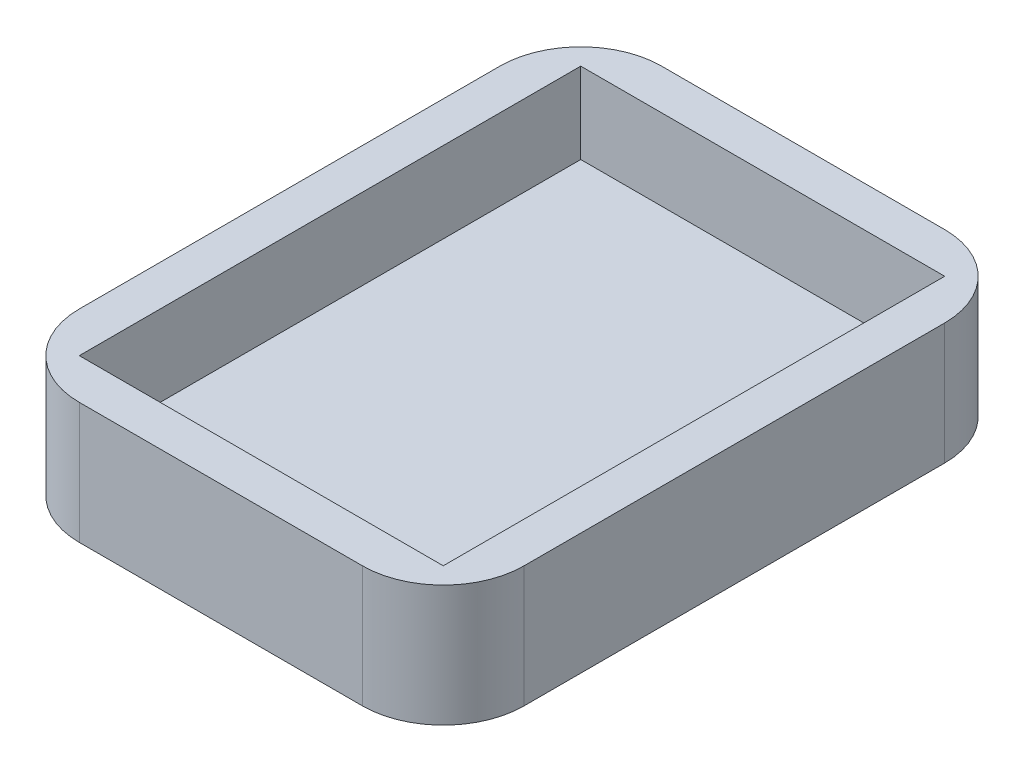
ISO-10303-21;
HEADER;
FILE_DESCRIPTION(('STEP AP214'),'2;1');
FILE_NAME('part.step','',(''),(''),'','','');
FILE_SCHEMA(('AUTOMOTIVE_DESIGN { 1 0 10303 214 1 1 1 1 }'));
ENDSEC;
DATA;
#1=APPLICATION_CONTEXT('core data for automotive mechanical design processes');
#2=APPLICATION_PROTOCOL_DEFINITION('international standard','automotive_design',2000,#1);
#3=PRODUCT_CONTEXT('',#1,'mechanical');
#4=PRODUCT('Part','Part','',(#3));
#5=PRODUCT_RELATED_PRODUCT_CATEGORY('part','',(#4));
#6=PRODUCT_DEFINITION_FORMATION('','',#4);
#7=PRODUCT_DEFINITION_CONTEXT('part definition',#1,'design');
#8=PRODUCT_DEFINITION('design','',#6,#7);
#9=PRODUCT_DEFINITION_SHAPE('','',#8);
#10=(LENGTH_UNIT() NAMED_UNIT(*) SI_UNIT(.MILLI.,.METRE.));
#11=(NAMED_UNIT(*) PLANE_ANGLE_UNIT() SI_UNIT($,.RADIAN.));
#12=(NAMED_UNIT(*) SI_UNIT($,.STERADIAN.) SOLID_ANGLE_UNIT());
#13=UNCERTAINTY_MEASURE_WITH_UNIT(LENGTH_MEASURE(1.E-05),#10,'distance_accuracy_value','');
#14=(GEOMETRIC_REPRESENTATION_CONTEXT(3) GLOBAL_UNCERTAINTY_ASSIGNED_CONTEXT((#13)) GLOBAL_UNIT_ASSIGNED_CONTEXT((#10,
#11,#12)) REPRESENTATION_CONTEXT('',''));
#15=CARTESIAN_POINT('',(0.,0.,0.));
#16=DIRECTION('',(0.,0.,1.));
#17=DIRECTION('',(1.,0.,0.));
#18=AXIS2_PLACEMENT_3D('',#15,#16,#17);
#19=CARTESIAN_POINT('',(0.,5.,0.));
#20=DIRECTION('',(0.,-1.,0.));
#21=DIRECTION('',(0.,0.,-1.));
#22=AXIS2_PLACEMENT_3D('',#19,#20,#21);
#23=PLANE('',#22);
#24=DIRECTION('',(0.,0.,1.));
#25=VECTOR('',#24,1.);
#26=CARTESIAN_POINT('',(0.,5.,0.));
#27=LINE('',#26,#25);
#28=CARTESIAN_POINT('',(0.,5.,-62.));
#29=VERTEX_POINT('',#28);
#30=CARTESIAN_POINT('',(0.,5.,0.));
#31=VERTEX_POINT('',#30);
#32=EDGE_CURVE('E135',#29,#31,#27,.T.);
#33=ORIENTED_EDGE('',*,*,#32,.T.);
#34=DIRECTION('',(1.,0.,0.));
#35=VECTOR('',#34,1.);
#36=CARTESIAN_POINT('',(0.,5.,0.));
#37=LINE('',#36,#35);
#38=CARTESIAN_POINT('',(45.,5.,0.));
#39=VERTEX_POINT('',#38);
#40=EDGE_CURVE('E185',#31,#39,#37,.T.);
#41=ORIENTED_EDGE('',*,*,#40,.T.);
#42=DIRECTION('',(0.,0.,-1.));
#43=VECTOR('',#42,1.);
#44=CARTESIAN_POINT('',(45.,5.,0.));
#45=LINE('',#44,#43);
#46=CARTESIAN_POINT('',(45.,5.,-62.));
#47=VERTEX_POINT('',#46);
#48=EDGE_CURVE('E188',#39,#47,#45,.T.);
#49=ORIENTED_EDGE('',*,*,#48,.T.);
#50=DIRECTION('',(-1.,0.,0.));
#51=VECTOR('',#50,1.);
#52=CARTESIAN_POINT('',(0.,5.,-62.));
#53=LINE('',#52,#51);
#54=EDGE_CURVE('E191',#47,#29,#53,.T.);
#55=ORIENTED_EDGE('',*,*,#54,.T.);
#56=EDGE_LOOP('',(#33,#41,#49,#55));
#57=FACE_BOUND('',#56,.T.);
#58=ADVANCED_FACE('F39',(#57),#23,.F.);
#59=CARTESIAN_POINT('',(45.,0.,-62.));
#60=DIRECTION('',(0.,0.,-1.));
#61=DIRECTION('',(-1.,0.,0.));
#62=AXIS2_PLACEMENT_3D('',#59,#60,#61);
#63=PLANE('',#62);
#64=DIRECTION('',(0.,1.,0.));
#65=VECTOR('',#64,1.);
#66=CARTESIAN_POINT('',(0.,0.,-62.));
#67=LINE('',#66,#65);
#68=CARTESIAN_POINT('',(0.,15.,-62.));
#69=VERTEX_POINT('',#68);
#70=EDGE_CURVE('E128',#29,#69,#67,.T.);
#71=ORIENTED_EDGE('',*,*,#70,.F.);
#72=ORIENTED_EDGE('',*,*,#54,.F.);
#73=DIRECTION('',(0.,1.,0.));
#74=VECTOR('',#73,1.);
#75=CARTESIAN_POINT('',(45.,0.,-62.));
#76=LINE('',#75,#74);
#77=CARTESIAN_POINT('',(45.,15.,-62.));
#78=VERTEX_POINT('',#77);
#79=EDGE_CURVE('E145',#47,#78,#76,.T.);
#80=ORIENTED_EDGE('',*,*,#79,.T.);
#81=DIRECTION('',(-1.,0.,0.));
#82=VECTOR('',#81,1.);
#83=CARTESIAN_POINT('',(45.,15.,-62.));
#84=LINE('',#83,#82);
#85=EDGE_CURVE('E142',#78,#69,#84,.T.);
#86=ORIENTED_EDGE('',*,*,#85,.T.);
#87=EDGE_LOOP('',(#71,#72,#80,#86));
#88=FACE_BOUND('',#87,.T.);
#89=ADVANCED_FACE('F143',(#88),#63,.F.);
#90=CARTESIAN_POINT('',(45.,0.,0.));
#91=DIRECTION('',(1.,0.,0.));
#92=DIRECTION('',(0.,0.,-1.));
#93=AXIS2_PLACEMENT_3D('',#90,#91,#92);
#94=PLANE('',#93);
#95=ORIENTED_EDGE('',*,*,#79,.F.);
#96=ORIENTED_EDGE('',*,*,#48,.F.);
#97=DIRECTION('',(0.,1.,0.));
#98=VECTOR('',#97,1.);
#99=CARTESIAN_POINT('',(45.,0.,0.));
#100=LINE('',#99,#98);
#101=CARTESIAN_POINT('',(45.,15.,0.));
#102=VERTEX_POINT('',#101);
#103=EDGE_CURVE('E171',#39,#102,#100,.T.);
#104=ORIENTED_EDGE('',*,*,#103,.T.);
#105=DIRECTION('',(0.,0.,-1.));
#106=VECTOR('',#105,1.);
#107=CARTESIAN_POINT('',(45.,15.,0.));
#108=LINE('',#107,#106);
#109=EDGE_CURVE('E154',#102,#78,#108,.T.);
#110=ORIENTED_EDGE('',*,*,#109,.T.);
#111=EDGE_LOOP('',(#95,#96,#104,#110));
#112=FACE_BOUND('',#111,.T.);
#113=ADVANCED_FACE('F266',(#112),#94,.F.);
#114=CARTESIAN_POINT('',(0.,0.,0.));
#115=DIRECTION('',(0.,0.,1.));
#116=DIRECTION('',(1.,0.,0.));
#117=AXIS2_PLACEMENT_3D('',#114,#115,#116);
#118=PLANE('',#117);
#119=ORIENTED_EDGE('',*,*,#103,.F.);
#120=ORIENTED_EDGE('',*,*,#40,.F.);
#121=DIRECTION('',(0.,1.,0.));
#122=VECTOR('',#121,1.);
#123=CARTESIAN_POINT('',(0.,0.,0.));
#124=LINE('',#123,#122);
#125=CARTESIAN_POINT('',(0.,15.,0.));
#126=VERTEX_POINT('',#125);
#127=EDGE_CURVE('E138',#31,#126,#124,.T.);
#128=ORIENTED_EDGE('',*,*,#127,.T.);
#129=DIRECTION('',(1.,0.,0.));
#130=VECTOR('',#129,1.);
#131=CARTESIAN_POINT('',(0.,15.,0.));
#132=LINE('',#131,#130);
#133=EDGE_CURVE('E152',#126,#102,#132,.T.);
#134=ORIENTED_EDGE('',*,*,#133,.T.);
#135=EDGE_LOOP('',(#119,#120,#128,#134));
#136=FACE_BOUND('',#135,.T.);
#137=ADVANCED_FACE('F336',(#136),#118,.F.);
#138=CARTESIAN_POINT('',(0.,0.,-62.));
#139=DIRECTION('',(-1.,0.,0.));
#140=DIRECTION('',(0.,0.,1.));
#141=AXIS2_PLACEMENT_3D('',#138,#139,#140);
#142=PLANE('',#141);
#143=ORIENTED_EDGE('',*,*,#127,.F.);
#144=ORIENTED_EDGE('',*,*,#32,.F.);
#145=ORIENTED_EDGE('',*,*,#70,.T.);
#146=DIRECTION('',(0.,0.,1.));
#147=VECTOR('',#146,1.);
#148=CARTESIAN_POINT('',(0.,15.,-62.));
#149=LINE('',#148,#147);
#150=EDGE_CURVE('E132',#69,#126,#149,.T.);
#151=ORIENTED_EDGE('',*,*,#150,.T.);
#152=EDGE_LOOP('',(#143,#144,#145,#151));
#153=FACE_BOUND('',#152,.T.);
#154=ADVANCED_FACE('F130',(#153),#142,.F.);
#155=CARTESIAN_POINT('',(-5.00000000000001,0.,5.));
#156=DIRECTION('',(0.,0.,1.));
#157=DIRECTION('',(1.,0.,0.));
#158=AXIS2_PLACEMENT_3D('',#155,#156,#157);
#159=PLANE('',#158);
#160=DIRECTION('',(1.,0.,0.));
#161=VECTOR('',#160,1.);
#162=CARTESIAN_POINT('',(-5.00000000000001,0.,5.));
#163=LINE('',#162,#161);
#164=CARTESIAN_POINT('',(4.99999999999999,0.,5.));
#165=VERTEX_POINT('',#164);
#166=CARTESIAN_POINT('',(40.,0.,5.));
#167=VERTEX_POINT('',#166);
#168=EDGE_CURVE('E170',#165,#167,#163,.T.);
#169=ORIENTED_EDGE('',*,*,#168,.T.);
#170=DIRECTION('',(0.,1.,0.));
#171=VECTOR('',#170,1.);
#172=CARTESIAN_POINT('',(40.,0.,5.));
#173=LINE('',#172,#171);
#174=CARTESIAN_POINT('',(40.,15.,5.));
#175=VERTEX_POINT('',#174);
#176=EDGE_CURVE('E220',#167,#175,#173,.T.);
#177=ORIENTED_EDGE('',*,*,#176,.T.);
#178=DIRECTION('',(1.,0.,0.));
#179=VECTOR('',#178,1.);
#180=CARTESIAN_POINT('',(-5.00000000000001,15.,5.));
#181=LINE('',#180,#179);
#182=CARTESIAN_POINT('',(4.99999999999999,15.,5.));
#183=VERTEX_POINT('',#182);
#184=EDGE_CURVE('E158',#183,#175,#181,.T.);
#185=ORIENTED_EDGE('',*,*,#184,.F.);
#186=DIRECTION('',(0.,1.,0.));
#187=VECTOR('',#186,1.);
#188=CARTESIAN_POINT('',(4.99999999999999,0.,5.));
#189=LINE('',#188,#187);
#190=EDGE_CURVE('E218',#183,#165,#189,.F.);
#191=ORIENTED_EDGE('',*,*,#190,.T.);
#192=EDGE_LOOP('',(#169,#177,#185,#191));
#193=FACE_BOUND('',#192,.T.);
#194=ADVANCED_FACE('F234',(#193),#159,.T.);
#195=CARTESIAN_POINT('',(-5.00000000000001,0.,-67.));
#196=DIRECTION('',(-1.,0.,0.));
#197=DIRECTION('',(0.,0.,1.));
#198=AXIS2_PLACEMENT_3D('',#195,#196,#197);
#199=PLANE('',#198);
#200=DIRECTION('',(0.,0.,1.));
#201=VECTOR('',#200,1.);
#202=CARTESIAN_POINT('',(-5.00000000000001,15.,-67.));
#203=LINE('',#202,#201);
#204=CARTESIAN_POINT('',(-5.00000000000001,15.,-57.));
#205=VERTEX_POINT('',#204);
#206=CARTESIAN_POINT('',(-5.00000000000001,15.,-5.));
#207=VERTEX_POINT('',#206);
#208=EDGE_CURVE('E139',#205,#207,#203,.T.);
#209=ORIENTED_EDGE('',*,*,#208,.F.);
#210=DIRECTION('',(0.,1.,0.));
#211=VECTOR('',#210,1.);
#212=CARTESIAN_POINT('',(-5.00000000000001,0.,-57.));
#213=LINE('',#212,#211);
#214=CARTESIAN_POINT('',(-5.00000000000001,0.,-57.));
#215=VERTEX_POINT('',#214);
#216=EDGE_CURVE('E209',#205,#215,#213,.F.);
#217=ORIENTED_EDGE('',*,*,#216,.T.);
#218=DIRECTION('',(0.,0.,1.));
#219=VECTOR('',#218,1.);
#220=CARTESIAN_POINT('',(-5.00000000000001,0.,-67.));
#221=LINE('',#220,#219);
#222=CARTESIAN_POINT('',(-5.00000000000001,0.,-5.));
#223=VERTEX_POINT('',#222);
#224=EDGE_CURVE('E181',#215,#223,#221,.T.);
#225=ORIENTED_EDGE('',*,*,#224,.T.);
#226=DIRECTION('',(0.,1.,0.));
#227=VECTOR('',#226,1.);
#228=CARTESIAN_POINT('',(-5.00000000000001,0.,-5.));
#229=LINE('',#228,#227);
#230=EDGE_CURVE('E206',#223,#207,#229,.T.);
#231=ORIENTED_EDGE('',*,*,#230,.T.);
#232=EDGE_LOOP('',(#209,#217,#225,#231));
#233=FACE_BOUND('',#232,.T.);
#234=ADVANCED_FACE('F244',(#233),#199,.T.);
#235=CARTESIAN_POINT('',(50.,0.,-67.));
#236=DIRECTION('',(0.,0.,-1.));
#237=DIRECTION('',(-1.,0.,0.));
#238=AXIS2_PLACEMENT_3D('',#235,#236,#237);
#239=PLANE('',#238);
#240=DIRECTION('',(-1.,0.,0.));
#241=VECTOR('',#240,1.);
#242=CARTESIAN_POINT('',(50.,0.,-67.));
#243=LINE('',#242,#241);
#244=CARTESIAN_POINT('',(40.,0.,-67.));
#245=VERTEX_POINT('',#244);
#246=CARTESIAN_POINT('',(4.99999999999998,0.,-67.));
#247=VERTEX_POINT('',#246);
#248=EDGE_CURVE('E178',#245,#247,#243,.T.);
#249=ORIENTED_EDGE('',*,*,#248,.T.);
#250=DIRECTION('',(0.,1.,0.));
#251=VECTOR('',#250,1.);
#252=CARTESIAN_POINT('',(4.99999999999998,0.,-67.));
#253=LINE('',#252,#251);
#254=CARTESIAN_POINT('',(4.99999999999998,15.,-67.));
#255=VERTEX_POINT('',#254);
#256=EDGE_CURVE('E195',#247,#255,#253,.T.);
#257=ORIENTED_EDGE('',*,*,#256,.T.);
#258=DIRECTION('',(-1.,0.,0.));
#259=VECTOR('',#258,1.);
#260=CARTESIAN_POINT('',(50.,15.,-67.));
#261=LINE('',#260,#259);
#262=CARTESIAN_POINT('',(40.,15.,-67.));
#263=VERTEX_POINT('',#262);
#264=EDGE_CURVE('E164',#263,#255,#261,.T.);
#265=ORIENTED_EDGE('',*,*,#264,.F.);
#266=DIRECTION('',(0.,1.,0.));
#267=VECTOR('',#266,1.);
#268=CARTESIAN_POINT('',(40.,0.,-67.));
#269=LINE('',#268,#267);
#270=EDGE_CURVE('E193',#263,#245,#269,.F.);
#271=ORIENTED_EDGE('',*,*,#270,.T.);
#272=EDGE_LOOP('',(#249,#257,#265,#271));
#273=FACE_BOUND('',#272,.T.);
#274=ADVANCED_FACE('F251',(#273),#239,.T.);
#275=CARTESIAN_POINT('',(50.,0.,5.));
#276=DIRECTION('',(1.,0.,0.));
#277=DIRECTION('',(0.,0.,-1.));
#278=AXIS2_PLACEMENT_3D('',#275,#276,#277);
#279=PLANE('',#278);
#280=DIRECTION('',(0.,0.,-1.));
#281=VECTOR('',#280,1.);
#282=CARTESIAN_POINT('',(50.,15.,5.));
#283=LINE('',#282,#281);
#284=CARTESIAN_POINT('',(50.,15.,-5.));
#285=VERTEX_POINT('',#284);
#286=CARTESIAN_POINT('',(50.,15.,-57.));
#287=VERTEX_POINT('',#286);
#288=EDGE_CURVE('E161',#285,#287,#283,.T.);
#289=ORIENTED_EDGE('',*,*,#288,.F.);
#290=DIRECTION('',(0.,1.,0.));
#291=VECTOR('',#290,1.);
#292=CARTESIAN_POINT('',(50.,0.,-5.));
#293=LINE('',#292,#291);
#294=CARTESIAN_POINT('',(50.,0.,-5.));
#295=VERTEX_POINT('',#294);
#296=EDGE_CURVE('E11',#285,#295,#293,.F.);
#297=ORIENTED_EDGE('',*,*,#296,.T.);
#298=DIRECTION('',(0.,0.,-1.));
#299=VECTOR('',#298,1.);
#300=CARTESIAN_POINT('',(50.,0.,5.));
#301=LINE('',#300,#299);
#302=CARTESIAN_POINT('',(50.,0.,-57.));
#303=VERTEX_POINT('',#302);
#304=EDGE_CURVE('E176',#295,#303,#301,.T.);
#305=ORIENTED_EDGE('',*,*,#304,.T.);
#306=DIRECTION('',(0.,1.,0.));
#307=VECTOR('',#306,1.);
#308=CARTESIAN_POINT('',(50.,0.,-57.));
#309=LINE('',#308,#307);
#310=EDGE_CURVE('E47',#303,#287,#309,.T.);
#311=ORIENTED_EDGE('',*,*,#310,.T.);
#312=EDGE_LOOP('',(#289,#297,#305,#311));
#313=FACE_BOUND('',#312,.T.);
#314=ADVANCED_FACE('F224',(#313),#279,.T.);
#315=CARTESIAN_POINT('',(0.,15.,0.));
#316=DIRECTION('',(0.,1.,0.));
#317=DIRECTION('',(0.,0.,1.));
#318=AXIS2_PLACEMENT_3D('',#315,#316,#317);
#319=PLANE('',#318);
#320=ORIENTED_EDGE('',*,*,#264,.T.);
#321=CARTESIAN_POINT('',(4.99999999999998,15.,-57.));
#322=DIRECTION('',(0.,1.,0.));
#323=DIRECTION('',(0.,0.,1.));
#324=AXIS2_PLACEMENT_3D('',#321,#322,#323);
#325=CIRCLE('',#324,10.);
#326=EDGE_CURVE('E204',#255,#205,#325,.T.);
#327=ORIENTED_EDGE('',*,*,#326,.T.);
#328=ORIENTED_EDGE('',*,*,#208,.T.);
#329=CARTESIAN_POINT('',(4.99999999999999,15.,-5.));
#330=DIRECTION('',(0.,1.,0.));
#331=DIRECTION('',(0.,0.,1.));
#332=AXIS2_PLACEMENT_3D('',#329,#330,#331);
#333=CIRCLE('',#332,10.);
#334=EDGE_CURVE('E198',#207,#183,#333,.T.);
#335=ORIENTED_EDGE('',*,*,#334,.T.);
#336=ORIENTED_EDGE('',*,*,#184,.T.);
#337=CARTESIAN_POINT('',(40.,15.,-5.));
#338=DIRECTION('',(0.,1.,0.));
#339=DIRECTION('',(0.,0.,1.));
#340=AXIS2_PLACEMENT_3D('',#337,#338,#339);
#341=CIRCLE('',#340,10.);
#342=EDGE_CURVE('E202',#175,#285,#341,.T.);
#343=ORIENTED_EDGE('',*,*,#342,.T.);
#344=ORIENTED_EDGE('',*,*,#288,.T.);
#345=CARTESIAN_POINT('',(40.,15.,-57.));
#346=DIRECTION('',(0.,1.,0.));
#347=DIRECTION('',(0.,0.,1.));
#348=AXIS2_PLACEMENT_3D('',#345,#346,#347);
#349=CIRCLE('',#348,10.);
#350=EDGE_CURVE('E200',#287,#263,#349,.T.);
#351=ORIENTED_EDGE('',*,*,#350,.T.);
#352=EDGE_LOOP('',(#320,#327,#328,#335,#336,#343,#344,#351));
#353=FACE_BOUND('',#352,.T.);
#354=ORIENTED_EDGE('',*,*,#150,.F.);
#355=ORIENTED_EDGE('',*,*,#85,.F.);
#356=ORIENTED_EDGE('',*,*,#109,.F.);
#357=ORIENTED_EDGE('',*,*,#133,.F.);
#358=EDGE_LOOP('',(#354,#355,#356,#357));
#359=FACE_BOUND('',#358,.T.);
#360=ADVANCED_FACE('F150',(#353,#359),#319,.T.);
#361=CARTESIAN_POINT('',(0.,0.,0.));
#362=DIRECTION('',(0.,-1.,0.));
#363=DIRECTION('',(0.,0.,-1.));
#364=AXIS2_PLACEMENT_3D('',#361,#362,#363);
#365=PLANE('',#364);
#366=ORIENTED_EDGE('',*,*,#224,.F.);
#367=CARTESIAN_POINT('',(4.99999999999998,0.,-57.));
#368=DIRECTION('',(0.,-1.,0.));
#369=DIRECTION('',(0.,0.,-1.));
#370=AXIS2_PLACEMENT_3D('',#367,#368,#369);
#371=CIRCLE('',#370,10.);
#372=EDGE_CURVE('E216',#215,#247,#371,.T.);
#373=ORIENTED_EDGE('',*,*,#372,.T.);
#374=ORIENTED_EDGE('',*,*,#248,.F.);
#375=CARTESIAN_POINT('',(40.,0.,-57.));
#376=DIRECTION('',(0.,-1.,0.));
#377=DIRECTION('',(0.,0.,-1.));
#378=AXIS2_PLACEMENT_3D('',#375,#376,#377);
#379=CIRCLE('',#378,10.);
#380=EDGE_CURVE('E54',#245,#303,#379,.T.);
#381=ORIENTED_EDGE('',*,*,#380,.T.);
#382=ORIENTED_EDGE('',*,*,#304,.F.);
#383=CARTESIAN_POINT('',(40.,0.,-5.));
#384=DIRECTION('',(0.,-1.,0.));
#385=DIRECTION('',(0.,0.,-1.));
#386=AXIS2_PLACEMENT_3D('',#383,#384,#385);
#387=CIRCLE('',#386,10.);
#388=EDGE_CURVE('E214',#295,#167,#387,.T.);
#389=ORIENTED_EDGE('',*,*,#388,.T.);
#390=ORIENTED_EDGE('',*,*,#168,.F.);
#391=CARTESIAN_POINT('',(4.99999999999999,0.,-5.));
#392=DIRECTION('',(0.,-1.,0.));
#393=DIRECTION('',(0.,0.,-1.));
#394=AXIS2_PLACEMENT_3D('',#391,#392,#393);
#395=CIRCLE('',#394,10.);
#396=EDGE_CURVE('E211',#165,#223,#395,.T.);
#397=ORIENTED_EDGE('',*,*,#396,.T.);
#398=EDGE_LOOP('',(#366,#373,#374,#381,#382,#389,#390,#397));
#399=FACE_BOUND('',#398,.T.);
#400=ADVANCED_FACE('F239',(#399),#365,.T.);
#401=CARTESIAN_POINT('',(4.99999999999998,0.,-57.));
#402=DIRECTION('',(0.,1.,0.));
#403=DIRECTION('',(0.,0.,1.));
#404=AXIS2_PLACEMENT_3D('',#401,#402,#403);
#405=CYLINDRICAL_SURFACE('',#404,10.);
#406=ORIENTED_EDGE('',*,*,#372,.F.);
#407=ORIENTED_EDGE('',*,*,#216,.F.);
#408=ORIENTED_EDGE('',*,*,#326,.F.);
#409=ORIENTED_EDGE('',*,*,#256,.F.);
#410=EDGE_LOOP('',(#406,#407,#408,#409));
#411=FACE_BOUND('',#410,.T.);
#412=ADVANCED_FACE('F249',(#411),#405,.T.);
#413=CARTESIAN_POINT('',(40.,0.,-5.));
#414=DIRECTION('',(0.,1.,0.));
#415=DIRECTION('',(0.,0.,1.));
#416=AXIS2_PLACEMENT_3D('',#413,#414,#415);
#417=CYLINDRICAL_SURFACE('',#416,10.);
#418=ORIENTED_EDGE('',*,*,#388,.F.);
#419=ORIENTED_EDGE('',*,*,#296,.F.);
#420=ORIENTED_EDGE('',*,*,#342,.F.);
#421=ORIENTED_EDGE('',*,*,#176,.F.);
#422=EDGE_LOOP('',(#418,#419,#420,#421));
#423=FACE_BOUND('',#422,.T.);
#424=ADVANCED_FACE('F232',(#423),#417,.T.);
#425=CARTESIAN_POINT('',(40.,0.,-57.));
#426=DIRECTION('',(0.,1.,0.));
#427=DIRECTION('',(0.,0.,1.));
#428=AXIS2_PLACEMENT_3D('',#425,#426,#427);
#429=CYLINDRICAL_SURFACE('',#428,10.);
#430=ORIENTED_EDGE('',*,*,#380,.F.);
#431=ORIENTED_EDGE('',*,*,#270,.F.);
#432=ORIENTED_EDGE('',*,*,#350,.F.);
#433=ORIENTED_EDGE('',*,*,#310,.F.);
#434=EDGE_LOOP('',(#430,#431,#432,#433));
#435=FACE_BOUND('',#434,.T.);
#436=ADVANCED_FACE('F253',(#435),#429,.T.);
#437=CARTESIAN_POINT('',(4.99999999999999,0.,-5.));
#438=DIRECTION('',(0.,1.,0.));
#439=DIRECTION('',(0.,0.,1.));
#440=AXIS2_PLACEMENT_3D('',#437,#438,#439);
#441=CYLINDRICAL_SURFACE('',#440,10.);
#442=ORIENTED_EDGE('',*,*,#396,.F.);
#443=ORIENTED_EDGE('',*,*,#190,.F.);
#444=ORIENTED_EDGE('',*,*,#334,.F.);
#445=ORIENTED_EDGE('',*,*,#230,.F.);
#446=EDGE_LOOP('',(#442,#443,#444,#445));
#447=FACE_BOUND('',#446,.T.);
#448=ADVANCED_FACE('F41',(#447),#441,.T.);
#449=CLOSED_SHELL('',(#58,#89,#113,#137,#154,#194,#234,#274,#314,#360,#400,#412,#424,#436,#448));
#450=MANIFOLD_SOLID_BREP('B2',#449);
#451=ADVANCED_BREP_SHAPE_REPRESENTATION('',(#18,#450),#14);
#452=SHAPE_DEFINITION_REPRESENTATION(#9,#451);
ENDSEC;
END-ISO-10303-21;
